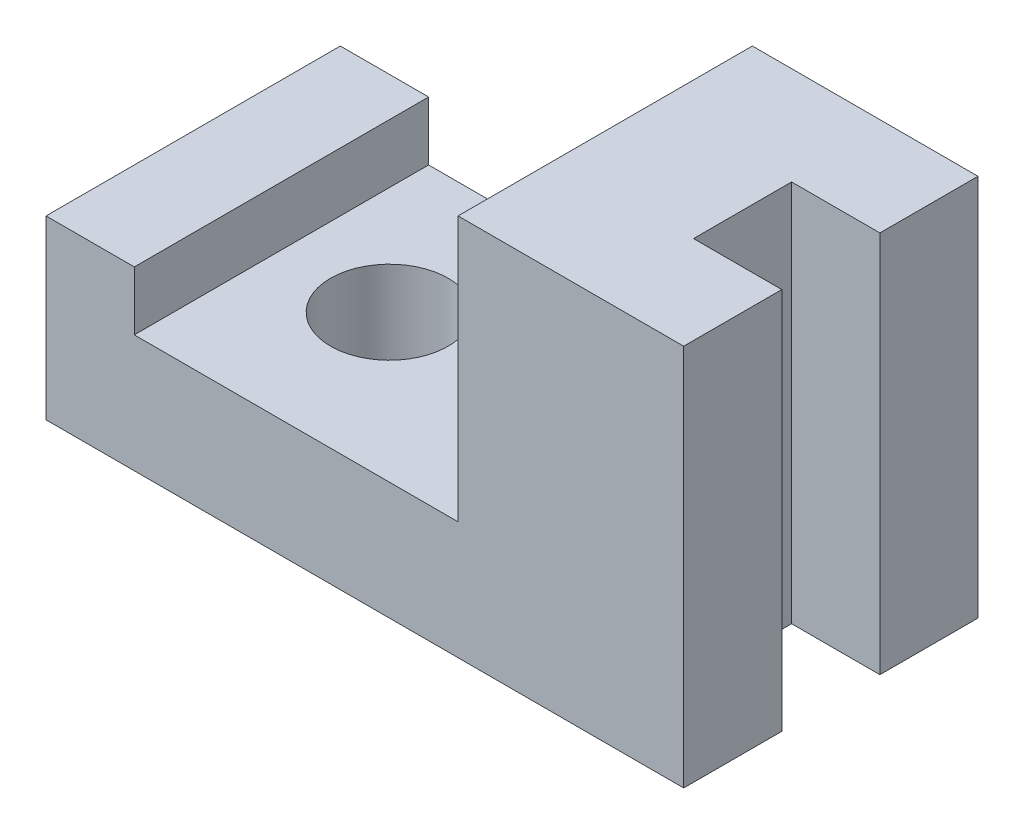
ISO-10303-21;
HEADER;
FILE_DESCRIPTION(('STEP AP214'),'2;1');
FILE_NAME('part.step','',(''),(''),'','','');
FILE_SCHEMA(('AUTOMOTIVE_DESIGN { 1 0 10303 214 1 1 1 1 }'));
ENDSEC;
DATA;
#1=APPLICATION_CONTEXT('core data for automotive mechanical design processes');
#2=APPLICATION_PROTOCOL_DEFINITION('international standard','automotive_design',2000,#1);
#3=PRODUCT_CONTEXT('',#1,'mechanical');
#4=PRODUCT('Part','Part','',(#3));
#5=PRODUCT_RELATED_PRODUCT_CATEGORY('part','',(#4));
#6=PRODUCT_DEFINITION_FORMATION('','',#4);
#7=PRODUCT_DEFINITION_CONTEXT('part definition',#1,'design');
#8=PRODUCT_DEFINITION('design','',#6,#7);
#9=PRODUCT_DEFINITION_SHAPE('','',#8);
#10=(LENGTH_UNIT() NAMED_UNIT(*) SI_UNIT(.MILLI.,.METRE.));
#11=(NAMED_UNIT(*) PLANE_ANGLE_UNIT() SI_UNIT($,.RADIAN.));
#12=(NAMED_UNIT(*) SI_UNIT($,.STERADIAN.) SOLID_ANGLE_UNIT());
#13=UNCERTAINTY_MEASURE_WITH_UNIT(LENGTH_MEASURE(1.E-05),#10,'distance_accuracy_value','');
#14=(GEOMETRIC_REPRESENTATION_CONTEXT(3) GLOBAL_UNCERTAINTY_ASSIGNED_CONTEXT((#13)) GLOBAL_UNIT_ASSIGNED_CONTEXT((#10,
#11,#12)) REPRESENTATION_CONTEXT('',''));
#15=CARTESIAN_POINT('',(0.,0.,0.));
#16=DIRECTION('',(0.,0.,1.));
#17=DIRECTION('',(1.,0.,0.));
#18=AXIS2_PLACEMENT_3D('',#15,#16,#17);
#19=CARTESIAN_POINT('',(65.,0.,15.));
#20=DIRECTION('',(-1.,0.,0.));
#21=DIRECTION('',(0.,0.,1.));
#22=AXIS2_PLACEMENT_3D('',#19,#20,#21);
#23=PLANE('',#22);
#24=DIRECTION('',(0.,0.,-1.));
#25=VECTOR('',#24,1.);
#26=CARTESIAN_POINT('',(65.,0.,15.));
#27=LINE('',#26,#25);
#28=CARTESIAN_POINT('',(65.,0.,15.));
#29=VERTEX_POINT('',#28);
#30=CARTESIAN_POINT('',(65.,0.,5.));
#31=VERTEX_POINT('',#30);
#32=EDGE_CURVE('E49',#29,#31,#27,.T.);
#33=ORIENTED_EDGE('',*,*,#32,.T.);
#34=DIRECTION('',(0.,-1.,0.));
#35=VECTOR('',#34,1.);
#36=CARTESIAN_POINT('',(65.,0.,5.));
#37=LINE('',#36,#35);
#38=CARTESIAN_POINT('',(65.,39.,5.));
#39=VERTEX_POINT('',#38);
#40=EDGE_CURVE('E217',#39,#31,#37,.T.);
#41=ORIENTED_EDGE('',*,*,#40,.F.);
#42=DIRECTION('',(0.,0.,-1.));
#43=VECTOR('',#42,1.);
#44=CARTESIAN_POINT('',(65.,39.,15.));
#45=LINE('',#44,#43);
#46=CARTESIAN_POINT('',(65.,39.,15.));
#47=VERTEX_POINT('',#46);
#48=EDGE_CURVE('E169',#47,#39,#45,.T.);
#49=ORIENTED_EDGE('',*,*,#48,.F.);
#50=DIRECTION('',(0.,1.,0.));
#51=VECTOR('',#50,1.);
#52=CARTESIAN_POINT('',(65.,0.,15.));
#53=LINE('',#52,#51);
#54=EDGE_CURVE('E200',#29,#47,#53,.T.);
#55=ORIENTED_EDGE('',*,*,#54,.F.);
#56=EDGE_LOOP('',(#33,#41,#49,#55));
#57=FACE_BOUND('',#56,.T.);
#58=ADVANCED_FACE('F41',(#57),#23,.F.);
#59=CARTESIAN_POINT('',(0.,0.,15.));
#60=DIRECTION('',(1.,0.,0.));
#61=DIRECTION('',(0.,0.,-1.));
#62=AXIS2_PLACEMENT_3D('',#59,#60,#61);
#63=PLANE('',#62);
#64=DIRECTION('',(0.,-1.,0.));
#65=VECTOR('',#64,1.);
#66=CARTESIAN_POINT('',(0.,0.,15.));
#67=LINE('',#66,#65);
#68=CARTESIAN_POINT('',(0.,18.,15.));
#69=VERTEX_POINT('',#68);
#70=CARTESIAN_POINT('',(0.,0.,15.));
#71=VERTEX_POINT('',#70);
#72=EDGE_CURVE('E146',#69,#71,#67,.T.);
#73=ORIENTED_EDGE('',*,*,#72,.F.);
#74=DIRECTION('',(0.,0.,1.));
#75=VECTOR('',#74,1.);
#76=CARTESIAN_POINT('',(0.,18.,-15.));
#77=LINE('',#76,#75);
#78=CARTESIAN_POINT('',(0.,18.,-15.));
#79=VERTEX_POINT('',#78);
#80=EDGE_CURVE('E134',#79,#69,#77,.T.);
#81=ORIENTED_EDGE('',*,*,#80,.F.);
#82=DIRECTION('',(0.,-1.,0.));
#83=VECTOR('',#82,1.);
#84=CARTESIAN_POINT('',(0.,0.,-15.));
#85=LINE('',#84,#83);
#86=CARTESIAN_POINT('',(0.,0.,-15.));
#87=VERTEX_POINT('',#86);
#88=EDGE_CURVE('E144',#79,#87,#85,.T.);
#89=ORIENTED_EDGE('',*,*,#88,.T.);
#90=DIRECTION('',(0.,0.,-1.));
#91=VECTOR('',#90,1.);
#92=CARTESIAN_POINT('',(0.,0.,15.));
#93=LINE('',#92,#91);
#94=EDGE_CURVE('E11',#71,#87,#93,.T.);
#95=ORIENTED_EDGE('',*,*,#94,.F.);
#96=EDGE_LOOP('',(#73,#81,#89,#95));
#97=FACE_BOUND('',#96,.T.);
#98=ADVANCED_FACE('F43',(#97),#63,.F.);
#99=CARTESIAN_POINT('',(0.,0.,15.));
#100=DIRECTION('',(0.,1.,0.));
#101=DIRECTION('',(0.,0.,1.));
#102=AXIS2_PLACEMENT_3D('',#99,#100,#101);
#103=PLANE('',#102);
#104=CARTESIAN_POINT('',(20.,0.,0.));
#105=DIRECTION('',(0.,1.,0.));
#106=DIRECTION('',(-1.,0.,0.));
#107=AXIS2_PLACEMENT_3D('',#104,#105,#106);
#108=CIRCLE('',#107,6.);
#109=CARTESIAN_POINT('',(14.,0.,0.));
#110=VERTEX_POINT('',#109);
#111=EDGE_CURVE('E139',#110,#110,#108,.T.);
#112=ORIENTED_EDGE('',*,*,#111,.T.);
#113=EDGE_LOOP('',(#112));
#114=FACE_BOUND('',#113,.T.);
#115=DIRECTION('',(0.,0.,-1.));
#116=VECTOR('',#115,1.);
#117=CARTESIAN_POINT('',(56.,0.,-5.));
#118=LINE('',#117,#116);
#119=CARTESIAN_POINT('',(56.,0.,5.));
#120=VERTEX_POINT('',#119);
#121=CARTESIAN_POINT('',(56.,0.,-5.));
#122=VERTEX_POINT('',#121);
#123=EDGE_CURVE('E222',#120,#122,#118,.T.);
#124=ORIENTED_EDGE('',*,*,#123,.F.);
#125=DIRECTION('',(1.,0.,0.));
#126=VECTOR('',#125,1.);
#127=CARTESIAN_POINT('',(56.,0.,5.));
#128=LINE('',#127,#126);
#129=EDGE_CURVE('E208',#120,#31,#128,.T.);
#130=ORIENTED_EDGE('',*,*,#129,.T.);
#131=ORIENTED_EDGE('',*,*,#32,.F.);
#132=DIRECTION('',(1.,0.,0.));
#133=VECTOR('',#132,1.);
#134=CARTESIAN_POINT('',(0.,0.,15.));
#135=LINE('',#134,#133);
#136=EDGE_CURVE('E203',#71,#29,#135,.T.);
#137=ORIENTED_EDGE('',*,*,#136,.F.);
#138=ORIENTED_EDGE('',*,*,#94,.T.);
#139=DIRECTION('',(1.,0.,0.));
#140=VECTOR('',#139,1.);
#141=CARTESIAN_POINT('',(0.,0.,-15.));
#142=LINE('',#141,#140);
#143=CARTESIAN_POINT('',(65.,0.,-15.));
#144=VERTEX_POINT('',#143);
#145=EDGE_CURVE('E153',#87,#144,#142,.T.);
#146=ORIENTED_EDGE('',*,*,#145,.T.);
#147=CARTESIAN_POINT('',(65.,0.,-5.));
#148=VERTEX_POINT('',#147);
#149=EDGE_CURVE('E171',#148,#144,#27,.T.);
#150=ORIENTED_EDGE('',*,*,#149,.F.);
#151=DIRECTION('',(1.,0.,0.));
#152=VECTOR('',#151,1.);
#153=CARTESIAN_POINT('',(56.,0.,-5.));
#154=LINE('',#153,#152);
#155=EDGE_CURVE('E211',#122,#148,#154,.T.);
#156=ORIENTED_EDGE('',*,*,#155,.F.);
#157=EDGE_LOOP('',(#124,#130,#131,#137,#138,#146,#150,#156));
#158=FACE_BOUND('',#157,.T.);
#159=ADVANCED_FACE('F188',(#114,#158),#103,.F.);
#160=CARTESIAN_POINT('',(65.,39.,-4.99999999999998));
#161=VERTEX_POINT('',#160);
#162=CARTESIAN_POINT('',(65.,39.,-15.));
#163=VERTEX_POINT('',#162);
#164=EDGE_CURVE('E172',#161,#163,#45,.T.);
#165=ORIENTED_EDGE('',*,*,#164,.F.);
#166=DIRECTION('',(0.,1.,0.));
#167=VECTOR('',#166,1.);
#168=CARTESIAN_POINT('',(65.,39.,-4.99999999999998));
#169=LINE('',#168,#167);
#170=EDGE_CURVE('E184',#148,#161,#169,.T.);
#171=ORIENTED_EDGE('',*,*,#170,.F.);
#172=ORIENTED_EDGE('',*,*,#149,.T.);
#173=DIRECTION('',(0.,1.,0.));
#174=VECTOR('',#173,1.);
#175=CARTESIAN_POINT('',(65.,0.,-15.));
#176=LINE('',#175,#174);
#177=EDGE_CURVE('E156',#144,#163,#176,.T.);
#178=ORIENTED_EDGE('',*,*,#177,.T.);
#179=EDGE_LOOP('',(#165,#171,#172,#178));
#180=FACE_BOUND('',#179,.T.);
#181=ADVANCED_FACE('F182',(#180),#23,.F.);
#182=CARTESIAN_POINT('',(0.,39.,15.));
#183=DIRECTION('',(0.,-1.,0.));
#184=DIRECTION('',(0.,0.,-1.));
#185=AXIS2_PLACEMENT_3D('',#182,#183,#184);
#186=PLANE('',#185);
#187=DIRECTION('',(-1.,0.,0.));
#188=VECTOR('',#187,1.);
#189=CARTESIAN_POINT('',(0.,39.,-15.));
#190=LINE('',#189,#188);
#191=CARTESIAN_POINT('',(42.,39.,-15.));
#192=VERTEX_POINT('',#191);
#193=EDGE_CURVE('E166',#163,#192,#190,.T.);
#194=ORIENTED_EDGE('',*,*,#193,.T.);
#195=DIRECTION('',(0.,0.,1.));
#196=VECTOR('',#195,1.);
#197=CARTESIAN_POINT('',(42.,39.,-15.));
#198=LINE('',#197,#196);
#199=CARTESIAN_POINT('',(42.,39.,15.));
#200=VERTEX_POINT('',#199);
#201=EDGE_CURVE('E196',#192,#200,#198,.T.);
#202=ORIENTED_EDGE('',*,*,#201,.T.);
#203=DIRECTION('',(-1.,0.,0.));
#204=VECTOR('',#203,1.);
#205=CARTESIAN_POINT('',(0.,39.,15.));
#206=LINE('',#205,#204);
#207=EDGE_CURVE('E161',#47,#200,#206,.T.);
#208=ORIENTED_EDGE('',*,*,#207,.F.);
#209=ORIENTED_EDGE('',*,*,#48,.T.);
#210=DIRECTION('',(1.,0.,0.));
#211=VECTOR('',#210,1.);
#212=CARTESIAN_POINT('',(56.,39.,5.));
#213=LINE('',#212,#211);
#214=CARTESIAN_POINT('',(56.,39.,5.));
#215=VERTEX_POINT('',#214);
#216=EDGE_CURVE('E154',#215,#39,#213,.T.);
#217=ORIENTED_EDGE('',*,*,#216,.F.);
#218=DIRECTION('',(0.,0.,1.));
#219=VECTOR('',#218,1.);
#220=CARTESIAN_POINT('',(56.,39.,5.));
#221=LINE('',#220,#219);
#222=CARTESIAN_POINT('',(56.,39.,-5.));
#223=VERTEX_POINT('',#222);
#224=EDGE_CURVE('E212',#223,#215,#221,.T.);
#225=ORIENTED_EDGE('',*,*,#224,.F.);
#226=DIRECTION('',(1.,0.,0.));
#227=VECTOR('',#226,1.);
#228=CARTESIAN_POINT('',(56.,39.,-4.99999999999998));
#229=LINE('',#228,#227);
#230=EDGE_CURVE('E158',#223,#161,#229,.T.);
#231=ORIENTED_EDGE('',*,*,#230,.T.);
#232=ORIENTED_EDGE('',*,*,#164,.T.);
#233=EDGE_LOOP('',(#194,#202,#208,#209,#217,#225,#231,#232));
#234=FACE_BOUND('',#233,.T.);
#235=ADVANCED_FACE('F194',(#234),#186,.F.);
#236=CARTESIAN_POINT('',(0.,0.,15.));
#237=DIRECTION('',(0.,0.,-1.));
#238=DIRECTION('',(-1.,0.,0.));
#239=AXIS2_PLACEMENT_3D('',#236,#237,#238);
#240=PLANE('',#239);
#241=ORIENTED_EDGE('',*,*,#207,.T.);
#242=DIRECTION('',(0.,-1.,0.));
#243=VECTOR('',#242,1.);
#244=CARTESIAN_POINT('',(42.,0.,15.));
#245=LINE('',#244,#243);
#246=CARTESIAN_POINT('',(42.,12.,15.));
#247=VERTEX_POINT('',#246);
#248=EDGE_CURVE('E219',#200,#247,#245,.T.);
#249=ORIENTED_EDGE('',*,*,#248,.T.);
#250=DIRECTION('',(-1.,0.,0.));
#251=VECTOR('',#250,1.);
#252=CARTESIAN_POINT('',(0.,12.,15.));
#253=LINE('',#252,#251);
#254=CARTESIAN_POINT('',(9.,12.,15.));
#255=VERTEX_POINT('',#254);
#256=EDGE_CURVE('E227',#247,#255,#253,.T.);
#257=ORIENTED_EDGE('',*,*,#256,.T.);
#258=DIRECTION('',(0.,1.,0.));
#259=VECTOR('',#258,1.);
#260=CARTESIAN_POINT('',(8.99999999999999,0.,15.));
#261=LINE('',#260,#259);
#262=CARTESIAN_POINT('',(9.,18.,15.));
#263=VERTEX_POINT('',#262);
#264=EDGE_CURVE('E230',#255,#263,#261,.T.);
#265=ORIENTED_EDGE('',*,*,#264,.T.);
#266=DIRECTION('',(-1.,0.,0.));
#267=VECTOR('',#266,1.);
#268=CARTESIAN_POINT('',(0.,18.,15.));
#269=LINE('',#268,#267);
#270=EDGE_CURVE('E233',#263,#69,#269,.T.);
#271=ORIENTED_EDGE('',*,*,#270,.T.);
#272=ORIENTED_EDGE('',*,*,#72,.T.);
#273=ORIENTED_EDGE('',*,*,#136,.T.);
#274=ORIENTED_EDGE('',*,*,#54,.T.);
#275=EDGE_LOOP('',(#241,#249,#257,#265,#271,#272,#273,#274));
#276=FACE_BOUND('',#275,.T.);
#277=ADVANCED_FACE('F268',(#276),#240,.F.);
#278=CARTESIAN_POINT('',(0.,0.,-15.));
#279=DIRECTION('',(0.,0.,-1.));
#280=DIRECTION('',(-1.,0.,0.));
#281=AXIS2_PLACEMENT_3D('',#278,#279,#280);
#282=PLANE('',#281);
#283=DIRECTION('',(0.,1.,0.));
#284=VECTOR('',#283,1.);
#285=CARTESIAN_POINT('',(42.,39.,-15.));
#286=LINE('',#285,#284);
#287=CARTESIAN_POINT('',(42.,12.,-15.));
#288=VERTEX_POINT('',#287);
#289=EDGE_CURVE('E147',#288,#192,#286,.T.);
#290=ORIENTED_EDGE('',*,*,#289,.T.);
#291=ORIENTED_EDGE('',*,*,#193,.F.);
#292=ORIENTED_EDGE('',*,*,#177,.F.);
#293=ORIENTED_EDGE('',*,*,#145,.F.);
#294=ORIENTED_EDGE('',*,*,#88,.F.);
#295=DIRECTION('',(1.,0.,0.));
#296=VECTOR('',#295,1.);
#297=CARTESIAN_POINT('',(9.,18.,-15.));
#298=LINE('',#297,#296);
#299=CARTESIAN_POINT('',(9.,18.,-15.));
#300=VERTEX_POINT('',#299);
#301=EDGE_CURVE('E131',#79,#300,#298,.T.);
#302=ORIENTED_EDGE('',*,*,#301,.T.);
#303=DIRECTION('',(0.,-1.,0.));
#304=VECTOR('',#303,1.);
#305=CARTESIAN_POINT('',(9.,12.,-15.));
#306=LINE('',#305,#304);
#307=CARTESIAN_POINT('',(9.,12.,-15.));
#308=VERTEX_POINT('',#307);
#309=EDGE_CURVE('E56',#300,#308,#306,.T.);
#310=ORIENTED_EDGE('',*,*,#309,.T.);
#311=DIRECTION('',(1.,0.,0.));
#312=VECTOR('',#311,1.);
#313=CARTESIAN_POINT('',(42.,12.,-15.));
#314=LINE('',#313,#312);
#315=EDGE_CURVE('E244',#308,#288,#314,.T.);
#316=ORIENTED_EDGE('',*,*,#315,.T.);
#317=EDGE_LOOP('',(#290,#291,#292,#293,#294,#302,#310,#316));
#318=FACE_BOUND('',#317,.T.);
#319=ADVANCED_FACE('F150',(#318),#282,.T.);
#320=CARTESIAN_POINT('',(56.,0.,5.));
#321=DIRECTION('',(0.,0.,1.));
#322=DIRECTION('',(1.,0.,0.));
#323=AXIS2_PLACEMENT_3D('',#320,#321,#322);
#324=PLANE('',#323);
#325=ORIENTED_EDGE('',*,*,#40,.T.);
#326=ORIENTED_EDGE('',*,*,#129,.F.);
#327=DIRECTION('',(0.,-1.,0.));
#328=VECTOR('',#327,1.);
#329=CARTESIAN_POINT('',(56.,0.,5.));
#330=LINE('',#329,#328);
#331=EDGE_CURVE('E216',#215,#120,#330,.T.);
#332=ORIENTED_EDGE('',*,*,#331,.F.);
#333=ORIENTED_EDGE('',*,*,#216,.T.);
#334=EDGE_LOOP('',(#325,#326,#332,#333));
#335=FACE_BOUND('',#334,.T.);
#336=ADVANCED_FACE('F327',(#335),#324,.F.);
#337=CARTESIAN_POINT('',(56.,39.,-4.99999999999998));
#338=DIRECTION('',(0.,0.,-1.));
#339=DIRECTION('',(0.,1.,0.));
#340=AXIS2_PLACEMENT_3D('',#337,#338,#339);
#341=PLANE('',#340);
#342=ORIENTED_EDGE('',*,*,#170,.T.);
#343=ORIENTED_EDGE('',*,*,#230,.F.);
#344=DIRECTION('',(0.,1.,0.));
#345=VECTOR('',#344,1.);
#346=CARTESIAN_POINT('',(56.,39.,-4.99999999999998));
#347=LINE('',#346,#345);
#348=EDGE_CURVE('E64',#122,#223,#347,.T.);
#349=ORIENTED_EDGE('',*,*,#348,.F.);
#350=ORIENTED_EDGE('',*,*,#155,.T.);
#351=EDGE_LOOP('',(#342,#343,#349,#350));
#352=FACE_BOUND('',#351,.T.);
#353=ADVANCED_FACE('F379',(#352),#341,.F.);
#354=CARTESIAN_POINT('',(56.,0.,0.));
#355=DIRECTION('',(-1.,0.,0.));
#356=DIRECTION('',(0.,0.,1.));
#357=AXIS2_PLACEMENT_3D('',#354,#355,#356);
#358=PLANE('',#357);
#359=ORIENTED_EDGE('',*,*,#331,.T.);
#360=ORIENTED_EDGE('',*,*,#123,.T.);
#361=ORIENTED_EDGE('',*,*,#348,.T.);
#362=ORIENTED_EDGE('',*,*,#224,.T.);
#363=EDGE_LOOP('',(#359,#360,#361,#362));
#364=FACE_BOUND('',#363,.T.);
#365=ADVANCED_FACE('F300',(#364),#358,.F.);
#366=CARTESIAN_POINT('',(42.,39.,-15.));
#367=DIRECTION('',(1.,0.,0.));
#368=DIRECTION('',(0.,1.,0.));
#369=AXIS2_PLACEMENT_3D('',#366,#367,#368);
#370=PLANE('',#369);
#371=ORIENTED_EDGE('',*,*,#201,.F.);
#372=ORIENTED_EDGE('',*,*,#289,.F.);
#373=DIRECTION('',(0.,0.,1.));
#374=VECTOR('',#373,1.);
#375=CARTESIAN_POINT('',(42.,12.,-15.));
#376=LINE('',#375,#374);
#377=EDGE_CURVE('E239',#288,#247,#376,.T.);
#378=ORIENTED_EDGE('',*,*,#377,.T.);
#379=ORIENTED_EDGE('',*,*,#248,.F.);
#380=EDGE_LOOP('',(#371,#372,#378,#379));
#381=FACE_BOUND('',#380,.T.);
#382=ADVANCED_FACE('F264',(#381),#370,.F.);
#383=CARTESIAN_POINT('',(42.,12.,-15.));
#384=DIRECTION('',(0.,-1.,0.));
#385=DIRECTION('',(1.,0.,0.));
#386=AXIS2_PLACEMENT_3D('',#383,#384,#385);
#387=PLANE('',#386);
#388=CARTESIAN_POINT('',(20.,12.,0.));
#389=DIRECTION('',(0.,1.,0.));
#390=DIRECTION('',(-1.,0.,0.));
#391=AXIS2_PLACEMENT_3D('',#388,#389,#390);
#392=CIRCLE('',#391,6.);
#393=CARTESIAN_POINT('',(14.,12.,0.));
#394=VERTEX_POINT('',#393);
#395=EDGE_CURVE('E247',#394,#394,#392,.T.);
#396=ORIENTED_EDGE('',*,*,#395,.F.);
#397=EDGE_LOOP('',(#396));
#398=FACE_BOUND('',#397,.T.);
#399=ORIENTED_EDGE('',*,*,#377,.F.);
#400=ORIENTED_EDGE('',*,*,#315,.F.);
#401=DIRECTION('',(0.,0.,1.));
#402=VECTOR('',#401,1.);
#403=CARTESIAN_POINT('',(9.,12.,-15.));
#404=LINE('',#403,#402);
#405=EDGE_CURVE('E236',#308,#255,#404,.T.);
#406=ORIENTED_EDGE('',*,*,#405,.T.);
#407=ORIENTED_EDGE('',*,*,#256,.F.);
#408=EDGE_LOOP('',(#399,#400,#406,#407));
#409=FACE_BOUND('',#408,.T.);
#410=ADVANCED_FACE('F260',(#398,#409),#387,.F.);
#411=CARTESIAN_POINT('',(9.,12.,-15.));
#412=DIRECTION('',(-1.,0.,0.));
#413=DIRECTION('',(0.,-1.,0.));
#414=AXIS2_PLACEMENT_3D('',#411,#412,#413);
#415=PLANE('',#414);
#416=ORIENTED_EDGE('',*,*,#405,.F.);
#417=ORIENTED_EDGE('',*,*,#309,.F.);
#418=DIRECTION('',(0.,0.,1.));
#419=VECTOR('',#418,1.);
#420=CARTESIAN_POINT('',(9.,18.,-15.));
#421=LINE('',#420,#419);
#422=EDGE_CURVE('E136',#300,#263,#421,.T.);
#423=ORIENTED_EDGE('',*,*,#422,.T.);
#424=ORIENTED_EDGE('',*,*,#264,.F.);
#425=EDGE_LOOP('',(#416,#417,#423,#424));
#426=FACE_BOUND('',#425,.T.);
#427=ADVANCED_FACE('F263',(#426),#415,.F.);
#428=CARTESIAN_POINT('',(9.,18.,-15.));
#429=DIRECTION('',(0.,-1.,0.));
#430=DIRECTION('',(0.,0.,-1.));
#431=AXIS2_PLACEMENT_3D('',#428,#429,#430);
#432=PLANE('',#431);
#433=ORIENTED_EDGE('',*,*,#422,.F.);
#434=ORIENTED_EDGE('',*,*,#301,.F.);
#435=ORIENTED_EDGE('',*,*,#80,.T.);
#436=ORIENTED_EDGE('',*,*,#270,.F.);
#437=EDGE_LOOP('',(#433,#434,#435,#436));
#438=FACE_BOUND('',#437,.T.);
#439=ADVANCED_FACE('F133',(#438),#432,.F.);
#440=CARTESIAN_POINT('',(20.,0.,0.));
#441=DIRECTION('',(0.,1.,0.));
#442=DIRECTION('',(-1.,0.,0.));
#443=AXIS2_PLACEMENT_3D('',#440,#441,#442);
#444=CYLINDRICAL_SURFACE('',#443,6.);
#445=ORIENTED_EDGE('',*,*,#111,.F.);
#446=EDGE_LOOP('',(#445));
#447=FACE_BOUND('',#446,.T.);
#448=ORIENTED_EDGE('',*,*,#395,.T.);
#449=EDGE_LOOP('',(#448));
#450=FACE_BOUND('',#449,.T.);
#451=ADVANCED_FACE('F254',(#447,#450),#444,.F.);
#452=CLOSED_SHELL('',(#58,#98,#159,#181,#235,#277,#319,#336,#353,#365,#382,#410,#427,#439,#451));
#453=MANIFOLD_SOLID_BREP('B2',#452);
#454=ADVANCED_BREP_SHAPE_REPRESENTATION('',(#18,#453),#14);
#455=SHAPE_DEFINITION_REPRESENTATION(#9,#454);
ENDSEC;
END-ISO-10303-21;
